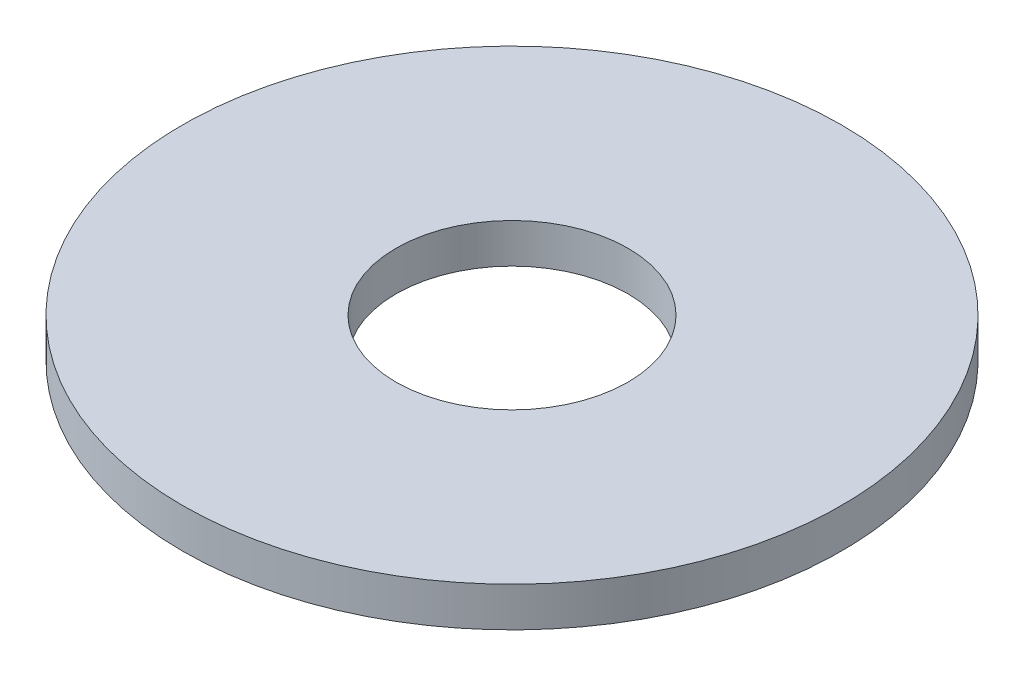
ISO-10303-21;
HEADER;
FILE_DESCRIPTION(('STEP AP214'),'2;1');
FILE_NAME('part.step','',(''),(''),'','','');
FILE_SCHEMA(('AUTOMOTIVE_DESIGN { 1 0 10303 214 1 1 1 1 }'));
ENDSEC;
DATA;
#1=APPLICATION_CONTEXT('core data for automotive mechanical design processes');
#2=APPLICATION_PROTOCOL_DEFINITION('international standard','automotive_design',2000,#1);
#3=PRODUCT_CONTEXT('',#1,'mechanical');
#4=PRODUCT('Part','Part','',(#3));
#5=PRODUCT_RELATED_PRODUCT_CATEGORY('part','',(#4));
#6=PRODUCT_DEFINITION_FORMATION('','',#4);
#7=PRODUCT_DEFINITION_CONTEXT('part definition',#1,'design');
#8=PRODUCT_DEFINITION('design','',#6,#7);
#9=PRODUCT_DEFINITION_SHAPE('','',#8);
#10=(LENGTH_UNIT() NAMED_UNIT(*) SI_UNIT(.MILLI.,.METRE.));
#11=(NAMED_UNIT(*) PLANE_ANGLE_UNIT() SI_UNIT($,.RADIAN.));
#12=(NAMED_UNIT(*) SI_UNIT($,.STERADIAN.) SOLID_ANGLE_UNIT());
#13=UNCERTAINTY_MEASURE_WITH_UNIT(LENGTH_MEASURE(1.E-05),#10,'distance_accuracy_value','');
#14=(GEOMETRIC_REPRESENTATION_CONTEXT(3) GLOBAL_UNCERTAINTY_ASSIGNED_CONTEXT((#13)) GLOBAL_UNIT_ASSIGNED_CONTEXT((#10,
#11,#12)) REPRESENTATION_CONTEXT('',''));
#15=CARTESIAN_POINT('',(0.,0.,0.));
#16=DIRECTION('',(0.,0.,1.));
#17=DIRECTION('',(1.,0.,0.));
#18=AXIS2_PLACEMENT_3D('',#15,#16,#17);
#19=CARTESIAN_POINT('',(0.,1.5,0.));
#20=DIRECTION('',(0.,1.,0.));
#21=DIRECTION('',(0.,0.,1.));
#22=AXIS2_PLACEMENT_3D('',#19,#20,#21);
#23=PLANE('',#22);
#24=CARTESIAN_POINT('',(0.,1.5,0.));
#25=DIRECTION('',(0.,1.,0.));
#26=DIRECTION('',(0.,0.,1.));
#27=AXIS2_PLACEMENT_3D('',#24,#25,#26);
#28=CIRCLE('',#27,12.5);
#29=CARTESIAN_POINT('',(0.,1.5,12.5));
#30=VERTEX_POINT('',#29);
#31=EDGE_CURVE('E10',#30,#30,#28,.T.);
#32=ORIENTED_EDGE('',*,*,#31,.T.);
#33=EDGE_LOOP('',(#32));
#34=FACE_BOUND('',#33,.T.);
#35=CARTESIAN_POINT('',(0.,1.5,0.));
#36=DIRECTION('',(0.,1.,0.));
#37=DIRECTION('',(0.,0.,1.));
#38=AXIS2_PLACEMENT_3D('',#35,#36,#37);
#39=CIRCLE('',#38,4.4);
#40=CARTESIAN_POINT('',(0.,1.5,4.4));
#41=VERTEX_POINT('',#40);
#42=EDGE_CURVE('E50',#41,#41,#39,.T.);
#43=ORIENTED_EDGE('',*,*,#42,.F.);
#44=EDGE_LOOP('',(#43));
#45=FACE_BOUND('',#44,.T.);
#46=ADVANCED_FACE('F39',(#34,#45),#23,.T.);
#47=CARTESIAN_POINT('',(0.,0.,0.));
#48=DIRECTION('',(0.,1.,0.));
#49=DIRECTION('',(0.,0.,1.));
#50=AXIS2_PLACEMENT_3D('',#47,#48,#49);
#51=PLANE('',#50);
#52=CARTESIAN_POINT('',(0.,0.,0.));
#53=DIRECTION('',(0.,1.,0.));
#54=DIRECTION('',(0.,0.,1.));
#55=AXIS2_PLACEMENT_3D('',#52,#53,#54);
#56=CIRCLE('',#55,12.5);
#57=CARTESIAN_POINT('',(0.,0.,12.5));
#58=VERTEX_POINT('',#57);
#59=EDGE_CURVE('E43',#58,#58,#56,.T.);
#60=ORIENTED_EDGE('',*,*,#59,.F.);
#61=EDGE_LOOP('',(#60));
#62=FACE_BOUND('',#61,.T.);
#63=CARTESIAN_POINT('',(0.,0.,0.));
#64=DIRECTION('',(0.,1.,0.));
#65=DIRECTION('',(0.,0.,1.));
#66=AXIS2_PLACEMENT_3D('',#63,#64,#65);
#67=CIRCLE('',#66,4.4);
#68=CARTESIAN_POINT('',(0.,0.,4.4));
#69=VERTEX_POINT('',#68);
#70=EDGE_CURVE('E52',#69,#69,#67,.T.);
#71=ORIENTED_EDGE('',*,*,#70,.T.);
#72=EDGE_LOOP('',(#71));
#73=FACE_BOUND('',#72,.T.);
#74=ADVANCED_FACE('F62',(#62,#73),#51,.F.);
#75=CARTESIAN_POINT('',(0.,1.5,0.));
#76=DIRECTION('',(0.,-1.,0.));
#77=DIRECTION('',(0.,0.,-1.));
#78=AXIS2_PLACEMENT_3D('',#75,#76,#77);
#79=CYLINDRICAL_SURFACE('',#78,12.5);
#80=ORIENTED_EDGE('',*,*,#31,.F.);
#81=EDGE_LOOP('',(#80));
#82=FACE_BOUND('',#81,.T.);
#83=ORIENTED_EDGE('',*,*,#59,.T.);
#84=EDGE_LOOP('',(#83));
#85=FACE_BOUND('',#84,.T.);
#86=ADVANCED_FACE('F41',(#82,#85),#79,.T.);
#87=CARTESIAN_POINT('',(0.,1.5,0.));
#88=DIRECTION('',(0.,-1.,0.));
#89=DIRECTION('',(0.,0.,-1.));
#90=AXIS2_PLACEMENT_3D('',#87,#88,#89);
#91=CYLINDRICAL_SURFACE('',#90,4.4);
#92=ORIENTED_EDGE('',*,*,#42,.T.);
#93=EDGE_LOOP('',(#92));
#94=FACE_BOUND('',#93,.T.);
#95=ORIENTED_EDGE('',*,*,#70,.F.);
#96=EDGE_LOOP('',(#95));
#97=FACE_BOUND('',#96,.T.);
#98=ADVANCED_FACE('F58',(#94,#97),#91,.F.);
#99=CLOSED_SHELL('',(#46,#74,#86,#98));
#100=MANIFOLD_SOLID_BREP('B2',#99);
#101=ADVANCED_BREP_SHAPE_REPRESENTATION('',(#18,#100),#14);
#102=SHAPE_DEFINITION_REPRESENTATION(#9,#101);
ENDSEC;
END-ISO-10303-21;
